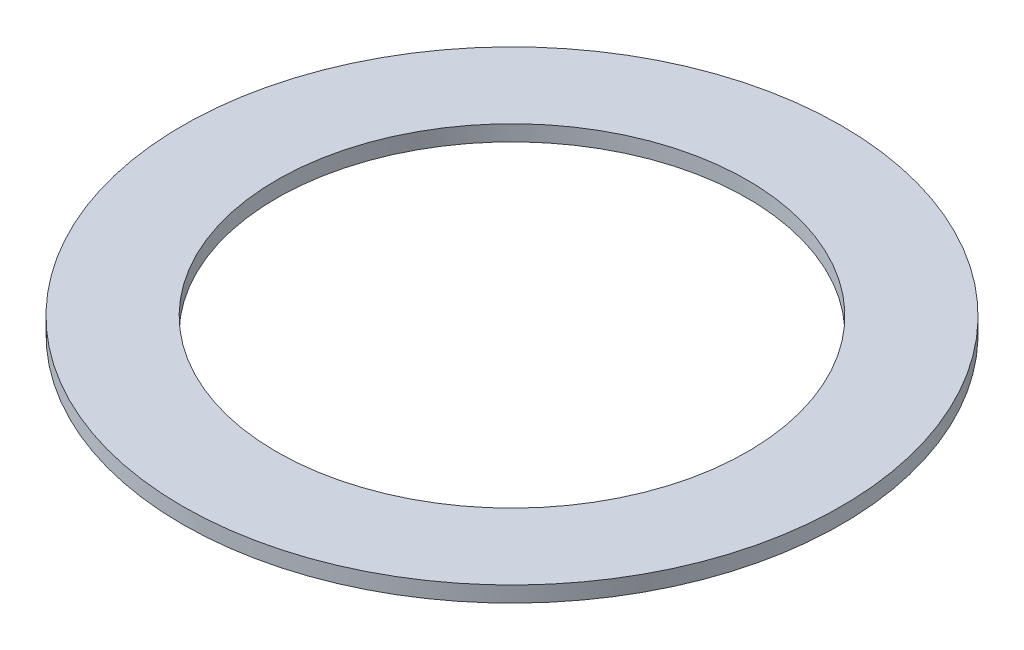
ISO-10303-21;
HEADER;
FILE_DESCRIPTION(('STEP AP214'),'2;1');
FILE_NAME('part.step','',(''),(''),'','','');
FILE_SCHEMA(('AUTOMOTIVE_DESIGN { 1 0 10303 214 1 1 1 1 }'));
ENDSEC;
DATA;
#1=APPLICATION_CONTEXT('core data for automotive mechanical design processes');
#2=APPLICATION_PROTOCOL_DEFINITION('international standard','automotive_design',2000,#1);
#3=PRODUCT_CONTEXT('',#1,'mechanical');
#4=PRODUCT('Part','Part','',(#3));
#5=PRODUCT_RELATED_PRODUCT_CATEGORY('part','',(#4));
#6=PRODUCT_DEFINITION_FORMATION('','',#4);
#7=PRODUCT_DEFINITION_CONTEXT('part definition',#1,'design');
#8=PRODUCT_DEFINITION('design','',#6,#7);
#9=PRODUCT_DEFINITION_SHAPE('','',#8);
#10=(LENGTH_UNIT() NAMED_UNIT(*) SI_UNIT(.MILLI.,.METRE.));
#11=(NAMED_UNIT(*) PLANE_ANGLE_UNIT() SI_UNIT($,.RADIAN.));
#12=(NAMED_UNIT(*) SI_UNIT($,.STERADIAN.) SOLID_ANGLE_UNIT());
#13=UNCERTAINTY_MEASURE_WITH_UNIT(LENGTH_MEASURE(1.E-05),#10,'distance_accuracy_value','');
#14=(GEOMETRIC_REPRESENTATION_CONTEXT(3) GLOBAL_UNCERTAINTY_ASSIGNED_CONTEXT((#13)) GLOBAL_UNIT_ASSIGNED_CONTEXT((#10,
#11,#12)) REPRESENTATION_CONTEXT('',''));
#15=CARTESIAN_POINT('',(0.,0.,0.));
#16=DIRECTION('',(0.,0.,1.));
#17=DIRECTION('',(1.,0.,0.));
#18=AXIS2_PLACEMENT_3D('',#15,#16,#17);
#19=CARTESIAN_POINT('',(0.,0.5,0.));
#20=DIRECTION('',(0.,1.,0.));
#21=DIRECTION('',(0.,0.,1.));
#22=AXIS2_PLACEMENT_3D('',#19,#20,#21);
#23=PLANE('',#22);
#24=CARTESIAN_POINT('',(0.,0.5,0.));
#25=DIRECTION('',(0.,1.,0.));
#26=DIRECTION('',(0.,0.,1.));
#27=AXIS2_PLACEMENT_3D('',#24,#25,#26);
#28=CIRCLE('',#27,10.5);
#29=CARTESIAN_POINT('',(0.,0.5,10.5));
#30=VERTEX_POINT('',#29);
#31=EDGE_CURVE('E12',#30,#30,#28,.T.);
#32=ORIENTED_EDGE('',*,*,#31,.T.);
#33=EDGE_LOOP('',(#32));
#34=FACE_BOUND('',#33,.T.);
#35=CARTESIAN_POINT('',(0.,0.5,0.));
#36=DIRECTION('',(0.,1.,0.));
#37=DIRECTION('',(0.,0.,1.));
#38=AXIS2_PLACEMENT_3D('',#35,#36,#37);
#39=CIRCLE('',#38,7.5);
#40=CARTESIAN_POINT('',(0.,0.5,7.5));
#41=VERTEX_POINT('',#40);
#42=EDGE_CURVE('E57',#41,#41,#39,.T.);
#43=ORIENTED_EDGE('',*,*,#42,.F.);
#44=EDGE_LOOP('',(#43));
#45=FACE_BOUND('',#44,.T.);
#46=ADVANCED_FACE('F46',(#34,#45),#23,.T.);
#47=CARTESIAN_POINT('',(0.,0.,0.));
#48=DIRECTION('',(0.,1.,0.));
#49=DIRECTION('',(0.,0.,1.));
#50=AXIS2_PLACEMENT_3D('',#47,#48,#49);
#51=PLANE('',#50);
#52=CARTESIAN_POINT('',(0.,0.,0.));
#53=DIRECTION('',(0.,1.,0.));
#54=DIRECTION('',(0.,0.,1.));
#55=AXIS2_PLACEMENT_3D('',#52,#53,#54);
#56=CIRCLE('',#55,10.5);
#57=CARTESIAN_POINT('',(0.,0.,10.5));
#58=VERTEX_POINT('',#57);
#59=EDGE_CURVE('E50',#58,#58,#56,.T.);
#60=ORIENTED_EDGE('',*,*,#59,.F.);
#61=EDGE_LOOP('',(#60));
#62=FACE_BOUND('',#61,.T.);
#63=CARTESIAN_POINT('',(0.,0.,0.));
#64=DIRECTION('',(0.,1.,0.));
#65=DIRECTION('',(0.,0.,1.));
#66=AXIS2_PLACEMENT_3D('',#63,#64,#65);
#67=CIRCLE('',#66,7.5);
#68=CARTESIAN_POINT('',(0.,0.,7.5));
#69=VERTEX_POINT('',#68);
#70=EDGE_CURVE('E59',#69,#69,#67,.T.);
#71=ORIENTED_EDGE('',*,*,#70,.T.);
#72=EDGE_LOOP('',(#71));
#73=FACE_BOUND('',#72,.T.);
#74=ADVANCED_FACE('F69',(#62,#73),#51,.F.);
#75=CARTESIAN_POINT('',(0.,0.5,0.));
#76=DIRECTION('',(0.,-1.,0.));
#77=DIRECTION('',(0.,0.,-1.));
#78=AXIS2_PLACEMENT_3D('',#75,#76,#77);
#79=CYLINDRICAL_SURFACE('',#78,10.5);
#80=ORIENTED_EDGE('',*,*,#31,.F.);
#81=EDGE_LOOP('',(#80));
#82=FACE_BOUND('',#81,.T.);
#83=ORIENTED_EDGE('',*,*,#59,.T.);
#84=EDGE_LOOP('',(#83));
#85=FACE_BOUND('',#84,.T.);
#86=ADVANCED_FACE('F48',(#82,#85),#79,.T.);
#87=CARTESIAN_POINT('',(0.,0.5,0.));
#88=DIRECTION('',(0.,-1.,0.));
#89=DIRECTION('',(0.,0.,-1.));
#90=AXIS2_PLACEMENT_3D('',#87,#88,#89);
#91=CYLINDRICAL_SURFACE('',#90,7.5);
#92=ORIENTED_EDGE('',*,*,#42,.T.);
#93=EDGE_LOOP('',(#92));
#94=FACE_BOUND('',#93,.T.);
#95=ORIENTED_EDGE('',*,*,#70,.F.);
#96=EDGE_LOOP('',(#95));
#97=FACE_BOUND('',#96,.T.);
#98=ADVANCED_FACE('F65',(#94,#97),#91,.F.);
#99=CLOSED_SHELL('',(#46,#74,#86,#98));
#100=MANIFOLD_SOLID_BREP('B2',#99);
#101=ADVANCED_BREP_SHAPE_REPRESENTATION('',(#18,#100),#14);
#102=SHAPE_DEFINITION_REPRESENTATION(#9,#101);
ENDSEC;
END-ISO-10303-21;
